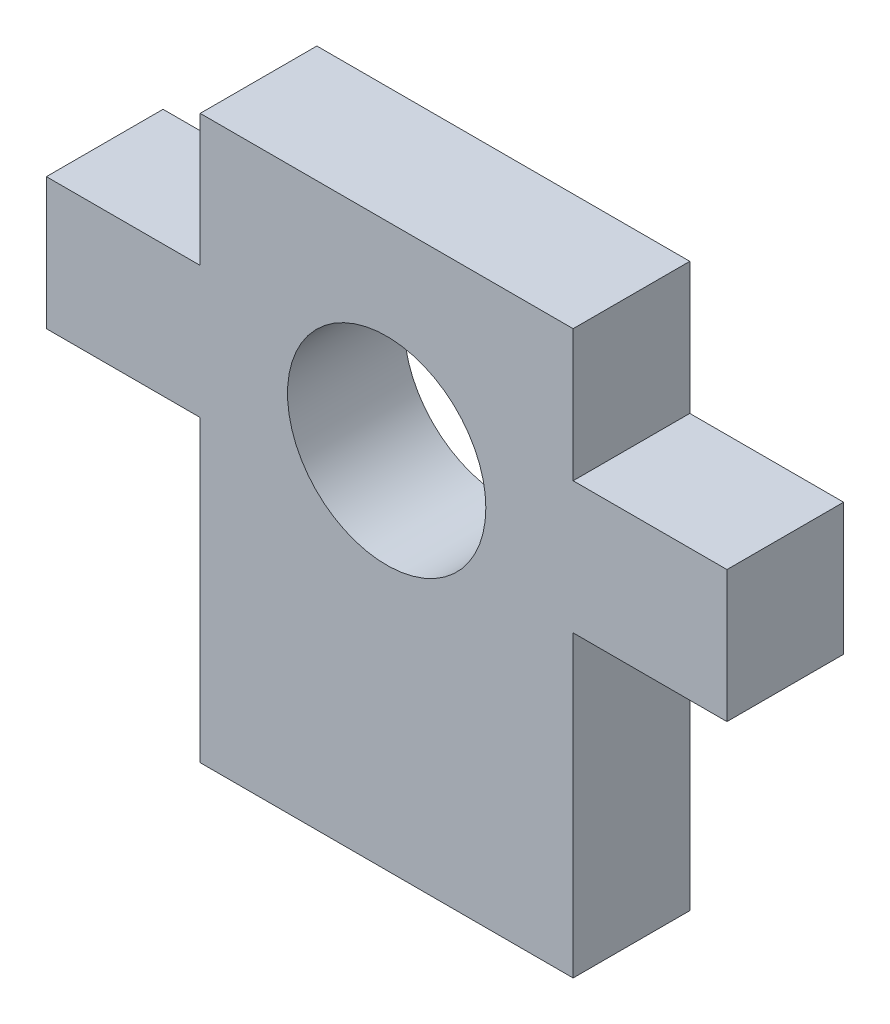
ISO-10303-21;
HEADER;
FILE_DESCRIPTION(('STEP AP214'),'2;1');
FILE_NAME('part.step','',(''),(''),'','','');
FILE_SCHEMA(('AUTOMOTIVE_DESIGN { 1 0 10303 214 1 1 1 1 }'));
ENDSEC;
DATA;
#1=APPLICATION_CONTEXT('core data for automotive mechanical design processes');
#2=APPLICATION_PROTOCOL_DEFINITION('international standard','automotive_design',2000,#1);
#3=PRODUCT_CONTEXT('',#1,'mechanical');
#4=PRODUCT('Part','Part','',(#3));
#5=PRODUCT_RELATED_PRODUCT_CATEGORY('part','',(#4));
#6=PRODUCT_DEFINITION_FORMATION('','',#4);
#7=PRODUCT_DEFINITION_CONTEXT('part definition',#1,'design');
#8=PRODUCT_DEFINITION('design','',#6,#7);
#9=PRODUCT_DEFINITION_SHAPE('','',#8);
#10=(LENGTH_UNIT() NAMED_UNIT(*) SI_UNIT(.MILLI.,.METRE.));
#11=(NAMED_UNIT(*) PLANE_ANGLE_UNIT() SI_UNIT($,.RADIAN.));
#12=(NAMED_UNIT(*) SI_UNIT($,.STERADIAN.) SOLID_ANGLE_UNIT());
#13=UNCERTAINTY_MEASURE_WITH_UNIT(LENGTH_MEASURE(1.E-05),#10,'distance_accuracy_value','');
#14=(GEOMETRIC_REPRESENTATION_CONTEXT(3) GLOBAL_UNCERTAINTY_ASSIGNED_CONTEXT((#13)) GLOBAL_UNIT_ASSIGNED_CONTEXT((#10,
#11,#12)) REPRESENTATION_CONTEXT('',''));
#15=CARTESIAN_POINT('',(0.,0.,0.));
#16=DIRECTION('',(0.,0.,1.));
#17=DIRECTION('',(1.,0.,0.));
#18=AXIS2_PLACEMENT_3D('',#15,#16,#17);
#19=CARTESIAN_POINT('',(-26.25,0.,9.));
#20=DIRECTION('',(1.,0.,0.));
#21=DIRECTION('',(0.,0.,-1.));
#22=AXIS2_PLACEMENT_3D('',#19,#20,#21);
#23=PLANE('',#22);
#24=DIRECTION('',(0.,-1.,0.));
#25=VECTOR('',#24,1.);
#26=CARTESIAN_POINT('',(-26.25,0.,0.));
#27=LINE('',#26,#25);
#28=CARTESIAN_POINT('',(-26.25,11.53,0.));
#29=VERTEX_POINT('',#28);
#30=CARTESIAN_POINT('',(-26.25,1.36999999999999,0.));
#31=VERTEX_POINT('',#30);
#32=EDGE_CURVE('E157',#29,#31,#27,.T.);
#33=ORIENTED_EDGE('',*,*,#32,.T.);
#34=DIRECTION('',(0.,0.,-1.));
#35=VECTOR('',#34,1.);
#36=CARTESIAN_POINT('',(-26.25,1.36999999999999,9.));
#37=LINE('',#36,#35);
#38=CARTESIAN_POINT('',(-26.25,1.36999999999999,9.));
#39=VERTEX_POINT('',#38);
#40=EDGE_CURVE('E11',#39,#31,#37,.T.);
#41=ORIENTED_EDGE('',*,*,#40,.F.);
#42=DIRECTION('',(0.,-1.,0.));
#43=VECTOR('',#42,1.);
#44=CARTESIAN_POINT('',(-26.25,0.,9.));
#45=LINE('',#44,#43);
#46=CARTESIAN_POINT('',(-26.25,11.53,9.));
#47=VERTEX_POINT('',#46);
#48=EDGE_CURVE('E188',#47,#39,#45,.T.);
#49=ORIENTED_EDGE('',*,*,#48,.F.);
#50=DIRECTION('',(0.,0.,-1.));
#51=VECTOR('',#50,1.);
#52=CARTESIAN_POINT('',(-26.25,11.53,9.));
#53=LINE('',#52,#51);
#54=EDGE_CURVE('E52',#47,#29,#53,.T.);
#55=ORIENTED_EDGE('',*,*,#54,.T.);
#56=EDGE_LOOP('',(#33,#41,#49,#55));
#57=FACE_BOUND('',#56,.T.);
#58=ADVANCED_FACE('F36',(#57),#23,.F.);
#59=CARTESIAN_POINT('',(0.,1.36999999999999,9.));
#60=DIRECTION('',(0.,1.,0.));
#61=DIRECTION('',(0.,0.,1.));
#62=AXIS2_PLACEMENT_3D('',#59,#60,#61);
#63=PLANE('',#62);
#64=DIRECTION('',(1.,0.,0.));
#65=VECTOR('',#64,1.);
#66=CARTESIAN_POINT('',(0.,1.36999999999999,0.));
#67=LINE('',#66,#65);
#68=CARTESIAN_POINT('',(-14.385,1.36999999999999,0.));
#69=VERTEX_POINT('',#68);
#70=EDGE_CURVE('E159',#31,#69,#67,.T.);
#71=ORIENTED_EDGE('',*,*,#70,.T.);
#72=DIRECTION('',(0.,0.,-1.));
#73=VECTOR('',#72,1.);
#74=CARTESIAN_POINT('',(-14.385,1.36999999999999,9.));
#75=LINE('',#74,#73);
#76=CARTESIAN_POINT('',(-14.385,1.36999999999999,9.));
#77=VERTEX_POINT('',#76);
#78=EDGE_CURVE('E44',#77,#69,#75,.T.);
#79=ORIENTED_EDGE('',*,*,#78,.F.);
#80=DIRECTION('',(1.,0.,0.));
#81=VECTOR('',#80,1.);
#82=CARTESIAN_POINT('',(0.,1.36999999999999,9.));
#83=LINE('',#82,#81);
#84=EDGE_CURVE('E102',#39,#77,#83,.T.);
#85=ORIENTED_EDGE('',*,*,#84,.F.);
#86=ORIENTED_EDGE('',*,*,#40,.T.);
#87=EDGE_LOOP('',(#71,#79,#85,#86));
#88=FACE_BOUND('',#87,.T.);
#89=ADVANCED_FACE('F211',(#88),#63,.F.);
#90=CARTESIAN_POINT('',(-14.385,0.,9.));
#91=DIRECTION('',(-1.,0.,0.));
#92=DIRECTION('',(0.,0.,1.));
#93=AXIS2_PLACEMENT_3D('',#90,#91,#92);
#94=PLANE('',#93);
#95=DIRECTION('',(0.,1.,0.));
#96=VECTOR('',#95,1.);
#97=CARTESIAN_POINT('',(-14.385,0.,0.));
#98=LINE('',#97,#96);
#99=CARTESIAN_POINT('',(-14.385,-21.69,0.));
#100=VERTEX_POINT('',#99);
#101=EDGE_CURVE('E163',#100,#69,#98,.T.);
#102=ORIENTED_EDGE('',*,*,#101,.F.);
#103=DIRECTION('',(0.,0.,-1.));
#104=VECTOR('',#103,1.);
#105=CARTESIAN_POINT('',(-14.385,-21.69,9.));
#106=LINE('',#105,#104);
#107=CARTESIAN_POINT('',(-14.385,-21.69,9.));
#108=VERTEX_POINT('',#107);
#109=EDGE_CURVE('E204',#108,#100,#106,.T.);
#110=ORIENTED_EDGE('',*,*,#109,.F.);
#111=DIRECTION('',(0.,1.,0.));
#112=VECTOR('',#111,1.);
#113=CARTESIAN_POINT('',(-14.385,0.,9.));
#114=LINE('',#113,#112);
#115=EDGE_CURVE('E210',#108,#77,#114,.T.);
#116=ORIENTED_EDGE('',*,*,#115,.T.);
#117=ORIENTED_EDGE('',*,*,#78,.T.);
#118=EDGE_LOOP('',(#102,#110,#116,#117));
#119=FACE_BOUND('',#118,.T.);
#120=ADVANCED_FACE('F208',(#119),#94,.T.);
#121=CARTESIAN_POINT('',(0.,-21.69,9.));
#122=DIRECTION('',(0.,1.,0.));
#123=DIRECTION('',(0.,0.,1.));
#124=AXIS2_PLACEMENT_3D('',#121,#122,#123);
#125=PLANE('',#124);
#126=DIRECTION('',(1.,0.,0.));
#127=VECTOR('',#126,1.);
#128=CARTESIAN_POINT('',(0.,-21.69,0.));
#129=LINE('',#128,#127);
#130=CARTESIAN_POINT('',(14.385,-21.69,0.));
#131=VERTEX_POINT('',#130);
#132=EDGE_CURVE('E166',#100,#131,#129,.T.);
#133=ORIENTED_EDGE('',*,*,#132,.T.);
#134=DIRECTION('',(0.,0.,-1.));
#135=VECTOR('',#134,1.);
#136=CARTESIAN_POINT('',(14.385,-21.69,9.));
#137=LINE('',#136,#135);
#138=CARTESIAN_POINT('',(14.385,-21.69,9.));
#139=VERTEX_POINT('',#138);
#140=EDGE_CURVE('E201',#139,#131,#137,.T.);
#141=ORIENTED_EDGE('',*,*,#140,.F.);
#142=DIRECTION('',(1.,0.,0.));
#143=VECTOR('',#142,1.);
#144=CARTESIAN_POINT('',(0.,-21.69,9.));
#145=LINE('',#144,#143);
#146=EDGE_CURVE('E229',#108,#139,#145,.T.);
#147=ORIENTED_EDGE('',*,*,#146,.F.);
#148=ORIENTED_EDGE('',*,*,#109,.T.);
#149=EDGE_LOOP('',(#133,#141,#147,#148));
#150=FACE_BOUND('',#149,.T.);
#151=ADVANCED_FACE('F220',(#150),#125,.F.);
#152=CARTESIAN_POINT('',(14.385,0.,9.));
#153=DIRECTION('',(-1.,0.,0.));
#154=DIRECTION('',(0.,0.,1.));
#155=AXIS2_PLACEMENT_3D('',#152,#153,#154);
#156=PLANE('',#155);
#157=DIRECTION('',(0.,1.,0.));
#158=VECTOR('',#157,1.);
#159=CARTESIAN_POINT('',(14.385,0.,0.));
#160=LINE('',#159,#158);
#161=CARTESIAN_POINT('',(14.385,1.36999999999999,0.));
#162=VERTEX_POINT('',#161);
#163=EDGE_CURVE('E168',#131,#162,#160,.T.);
#164=ORIENTED_EDGE('',*,*,#163,.T.);
#165=DIRECTION('',(0.,0.,-1.));
#166=VECTOR('',#165,1.);
#167=CARTESIAN_POINT('',(14.385,1.36999999999999,9.));
#168=LINE('',#167,#166);
#169=CARTESIAN_POINT('',(14.385,1.36999999999999,9.));
#170=VERTEX_POINT('',#169);
#171=EDGE_CURVE('E198',#170,#162,#168,.T.);
#172=ORIENTED_EDGE('',*,*,#171,.F.);
#173=DIRECTION('',(0.,1.,0.));
#174=VECTOR('',#173,1.);
#175=CARTESIAN_POINT('',(14.385,0.,9.));
#176=LINE('',#175,#174);
#177=EDGE_CURVE('E226',#139,#170,#176,.T.);
#178=ORIENTED_EDGE('',*,*,#177,.F.);
#179=ORIENTED_EDGE('',*,*,#140,.T.);
#180=EDGE_LOOP('',(#164,#172,#178,#179));
#181=FACE_BOUND('',#180,.T.);
#182=ADVANCED_FACE('F224',(#181),#156,.F.);
#183=CARTESIAN_POINT('',(0.,1.36999999999999,9.));
#184=DIRECTION('',(0.,1.,0.));
#185=DIRECTION('',(0.,0.,1.));
#186=AXIS2_PLACEMENT_3D('',#183,#184,#185);
#187=PLANE('',#186);
#188=DIRECTION('',(1.,0.,0.));
#189=VECTOR('',#188,1.);
#190=CARTESIAN_POINT('',(0.,1.36999999999999,0.));
#191=LINE('',#190,#189);
#192=CARTESIAN_POINT('',(26.25,1.36999999999999,0.));
#193=VERTEX_POINT('',#192);
#194=EDGE_CURVE('E170',#162,#193,#191,.T.);
#195=ORIENTED_EDGE('',*,*,#194,.T.);
#196=DIRECTION('',(0.,0.,-1.));
#197=VECTOR('',#196,1.);
#198=CARTESIAN_POINT('',(26.25,1.36999999999999,9.));
#199=LINE('',#198,#197);
#200=CARTESIAN_POINT('',(26.25,1.36999999999999,9.));
#201=VERTEX_POINT('',#200);
#202=EDGE_CURVE('E196',#201,#193,#199,.T.);
#203=ORIENTED_EDGE('',*,*,#202,.F.);
#204=DIRECTION('',(1.,0.,0.));
#205=VECTOR('',#204,1.);
#206=CARTESIAN_POINT('',(0.,1.36999999999999,9.));
#207=LINE('',#206,#205);
#208=EDGE_CURVE('E228',#170,#201,#207,.T.);
#209=ORIENTED_EDGE('',*,*,#208,.F.);
#210=ORIENTED_EDGE('',*,*,#171,.T.);
#211=EDGE_LOOP('',(#195,#203,#209,#210));
#212=FACE_BOUND('',#211,.T.);
#213=ADVANCED_FACE('F338',(#212),#187,.F.);
#214=CARTESIAN_POINT('',(26.25,0.,9.));
#215=DIRECTION('',(1.,0.,0.));
#216=DIRECTION('',(0.,0.,-1.));
#217=AXIS2_PLACEMENT_3D('',#214,#215,#216);
#218=PLANE('',#217);
#219=DIRECTION('',(0.,-1.,0.));
#220=VECTOR('',#219,1.);
#221=CARTESIAN_POINT('',(26.25,0.,0.));
#222=LINE('',#221,#220);
#223=CARTESIAN_POINT('',(26.25,11.53,0.));
#224=VERTEX_POINT('',#223);
#225=EDGE_CURVE('E173',#224,#193,#222,.T.);
#226=ORIENTED_EDGE('',*,*,#225,.F.);
#227=DIRECTION('',(0.,0.,-1.));
#228=VECTOR('',#227,1.);
#229=CARTESIAN_POINT('',(26.25,11.53,9.));
#230=LINE('',#229,#228);
#231=CARTESIAN_POINT('',(26.25,11.53,9.));
#232=VERTEX_POINT('',#231);
#233=EDGE_CURVE('E194',#232,#224,#230,.T.);
#234=ORIENTED_EDGE('',*,*,#233,.F.);
#235=DIRECTION('',(0.,-1.,0.));
#236=VECTOR('',#235,1.);
#237=CARTESIAN_POINT('',(26.25,0.,9.));
#238=LINE('',#237,#236);
#239=EDGE_CURVE('E231',#232,#201,#238,.T.);
#240=ORIENTED_EDGE('',*,*,#239,.T.);
#241=ORIENTED_EDGE('',*,*,#202,.T.);
#242=EDGE_LOOP('',(#226,#234,#240,#241));
#243=FACE_BOUND('',#242,.T.);
#244=ADVANCED_FACE('F247',(#243),#218,.T.);
#245=CARTESIAN_POINT('',(0.,11.53,9.));
#246=DIRECTION('',(0.,1.,0.));
#247=DIRECTION('',(0.,0.,1.));
#248=AXIS2_PLACEMENT_3D('',#245,#246,#247);
#249=PLANE('',#248);
#250=DIRECTION('',(1.,0.,0.));
#251=VECTOR('',#250,1.);
#252=CARTESIAN_POINT('',(0.,11.53,0.));
#253=LINE('',#252,#251);
#254=CARTESIAN_POINT('',(14.385,11.53,0.));
#255=VERTEX_POINT('',#254);
#256=EDGE_CURVE('E176',#255,#224,#253,.T.);
#257=ORIENTED_EDGE('',*,*,#256,.F.);
#258=DIRECTION('',(0.,0.,-1.));
#259=VECTOR('',#258,1.);
#260=CARTESIAN_POINT('',(14.385,11.53,9.));
#261=LINE('',#260,#259);
#262=CARTESIAN_POINT('',(14.385,11.53,9.));
#263=VERTEX_POINT('',#262);
#264=EDGE_CURVE('E192',#263,#255,#261,.T.);
#265=ORIENTED_EDGE('',*,*,#264,.F.);
#266=DIRECTION('',(1.,0.,0.));
#267=VECTOR('',#266,1.);
#268=CARTESIAN_POINT('',(0.,11.53,9.));
#269=LINE('',#268,#267);
#270=EDGE_CURVE('E238',#263,#232,#269,.T.);
#271=ORIENTED_EDGE('',*,*,#270,.T.);
#272=ORIENTED_EDGE('',*,*,#233,.T.);
#273=EDGE_LOOP('',(#257,#265,#271,#272));
#274=FACE_BOUND('',#273,.T.);
#275=ADVANCED_FACE('F242',(#274),#249,.T.);
#276=CARTESIAN_POINT('',(14.385,0.,9.));
#277=DIRECTION('',(-1.,0.,0.));
#278=DIRECTION('',(0.,0.,1.));
#279=AXIS2_PLACEMENT_3D('',#276,#277,#278);
#280=PLANE('',#279);
#281=DIRECTION('',(0.,1.,0.));
#282=VECTOR('',#281,1.);
#283=CARTESIAN_POINT('',(14.385,0.,0.));
#284=LINE('',#283,#282);
#285=CARTESIAN_POINT('',(14.385,21.69,0.));
#286=VERTEX_POINT('',#285);
#287=EDGE_CURVE('E179',#255,#286,#284,.T.);
#288=ORIENTED_EDGE('',*,*,#287,.T.);
#289=DIRECTION('',(0.,0.,-1.));
#290=VECTOR('',#289,1.);
#291=CARTESIAN_POINT('',(14.385,21.69,9.));
#292=LINE('',#291,#290);
#293=CARTESIAN_POINT('',(14.385,21.69,9.));
#294=VERTEX_POINT('',#293);
#295=EDGE_CURVE('E139',#294,#286,#292,.T.);
#296=ORIENTED_EDGE('',*,*,#295,.F.);
#297=DIRECTION('',(0.,1.,0.));
#298=VECTOR('',#297,1.);
#299=CARTESIAN_POINT('',(14.385,0.,9.));
#300=LINE('',#299,#298);
#301=EDGE_CURVE('E148',#263,#294,#300,.T.);
#302=ORIENTED_EDGE('',*,*,#301,.F.);
#303=ORIENTED_EDGE('',*,*,#264,.T.);
#304=EDGE_LOOP('',(#288,#296,#302,#303));
#305=FACE_BOUND('',#304,.T.);
#306=ADVANCED_FACE('F250',(#305),#280,.F.);
#307=CARTESIAN_POINT('',(0.,21.69,9.));
#308=DIRECTION('',(0.,1.,0.));
#309=DIRECTION('',(0.,0.,1.));
#310=AXIS2_PLACEMENT_3D('',#307,#308,#309);
#311=PLANE('',#310);
#312=DIRECTION('',(1.,0.,0.));
#313=VECTOR('',#312,1.);
#314=CARTESIAN_POINT('',(0.,21.69,0.));
#315=LINE('',#314,#313);
#316=CARTESIAN_POINT('',(-14.385,21.69,0.));
#317=VERTEX_POINT('',#316);
#318=EDGE_CURVE('E135',#317,#286,#315,.T.);
#319=ORIENTED_EDGE('',*,*,#318,.F.);
#320=DIRECTION('',(0.,0.,-1.));
#321=VECTOR('',#320,1.);
#322=CARTESIAN_POINT('',(-14.385,21.69,9.));
#323=LINE('',#322,#321);
#324=CARTESIAN_POINT('',(-14.385,21.69,9.));
#325=VERTEX_POINT('',#324);
#326=EDGE_CURVE('E130',#325,#317,#323,.T.);
#327=ORIENTED_EDGE('',*,*,#326,.F.);
#328=DIRECTION('',(1.,0.,0.));
#329=VECTOR('',#328,1.);
#330=CARTESIAN_POINT('',(0.,21.69,9.));
#331=LINE('',#330,#329);
#332=EDGE_CURVE('E133',#325,#294,#331,.T.);
#333=ORIENTED_EDGE('',*,*,#332,.T.);
#334=ORIENTED_EDGE('',*,*,#295,.T.);
#335=EDGE_LOOP('',(#319,#327,#333,#334));
#336=FACE_BOUND('',#335,.T.);
#337=ADVANCED_FACE('F132',(#336),#311,.T.);
#338=CARTESIAN_POINT('',(-14.385,0.,9.));
#339=DIRECTION('',(-1.,0.,0.));
#340=DIRECTION('',(0.,0.,1.));
#341=AXIS2_PLACEMENT_3D('',#338,#339,#340);
#342=PLANE('',#341);
#343=DIRECTION('',(0.,1.,0.));
#344=VECTOR('',#343,1.);
#345=CARTESIAN_POINT('',(-14.385,0.,0.));
#346=LINE('',#345,#344);
#347=CARTESIAN_POINT('',(-14.385,11.53,0.));
#348=VERTEX_POINT('',#347);
#349=EDGE_CURVE('E183',#348,#317,#346,.T.);
#350=ORIENTED_EDGE('',*,*,#349,.F.);
#351=DIRECTION('',(0.,0.,-1.));
#352=VECTOR('',#351,1.);
#353=CARTESIAN_POINT('',(-14.385,11.53,9.));
#354=LINE('',#353,#352);
#355=CARTESIAN_POINT('',(-14.385,11.53,9.));
#356=VERTEX_POINT('',#355);
#357=EDGE_CURVE('E90',#356,#348,#354,.T.);
#358=ORIENTED_EDGE('',*,*,#357,.F.);
#359=DIRECTION('',(0.,1.,0.));
#360=VECTOR('',#359,1.);
#361=CARTESIAN_POINT('',(-14.385,0.,9.));
#362=LINE('',#361,#360);
#363=EDGE_CURVE('E145',#356,#325,#362,.T.);
#364=ORIENTED_EDGE('',*,*,#363,.T.);
#365=ORIENTED_EDGE('',*,*,#326,.T.);
#366=EDGE_LOOP('',(#350,#358,#364,#365));
#367=FACE_BOUND('',#366,.T.);
#368=ADVANCED_FACE('F151',(#367),#342,.T.);
#369=CARTESIAN_POINT('',(0.,11.53,9.));
#370=DIRECTION('',(0.,1.,0.));
#371=DIRECTION('',(0.,0.,1.));
#372=AXIS2_PLACEMENT_3D('',#369,#370,#371);
#373=PLANE('',#372);
#374=DIRECTION('',(1.,0.,0.));
#375=VECTOR('',#374,1.);
#376=CARTESIAN_POINT('',(0.,11.53,0.));
#377=LINE('',#376,#375);
#378=EDGE_CURVE('E185',#29,#348,#377,.T.);
#379=ORIENTED_EDGE('',*,*,#378,.F.);
#380=ORIENTED_EDGE('',*,*,#54,.F.);
#381=DIRECTION('',(1.,0.,0.));
#382=VECTOR('',#381,1.);
#383=CARTESIAN_POINT('',(0.,11.53,9.));
#384=LINE('',#383,#382);
#385=EDGE_CURVE('E152',#47,#356,#384,.T.);
#386=ORIENTED_EDGE('',*,*,#385,.T.);
#387=ORIENTED_EDGE('',*,*,#357,.T.);
#388=EDGE_LOOP('',(#379,#380,#386,#387));
#389=FACE_BOUND('',#388,.T.);
#390=ADVANCED_FACE('F263',(#389),#373,.T.);
#391=CARTESIAN_POINT('',(0.,0.,9.));
#392=DIRECTION('',(0.,0.,1.));
#393=DIRECTION('',(1.,0.,0.));
#394=AXIS2_PLACEMENT_3D('',#391,#392,#393);
#395=PLANE('',#394);
#396=CARTESIAN_POINT('',(0.,6.35,9.));
#397=DIRECTION('',(0.,0.,1.));
#398=DIRECTION('',(1.,0.,0.));
#399=AXIS2_PLACEMENT_3D('',#396,#397,#398);
#400=CIRCLE('',#399,7.65);
#401=CARTESIAN_POINT('',(7.65,6.35,9.));
#402=VERTEX_POINT('',#401);
#403=EDGE_CURVE('E287',#402,#402,#400,.T.);
#404=ORIENTED_EDGE('',*,*,#403,.F.);
#405=EDGE_LOOP('',(#404));
#406=FACE_BOUND('',#405,.T.);
#407=ORIENTED_EDGE('',*,*,#48,.T.);
#408=ORIENTED_EDGE('',*,*,#84,.T.);
#409=ORIENTED_EDGE('',*,*,#115,.F.);
#410=ORIENTED_EDGE('',*,*,#146,.T.);
#411=ORIENTED_EDGE('',*,*,#177,.T.);
#412=ORIENTED_EDGE('',*,*,#208,.T.);
#413=ORIENTED_EDGE('',*,*,#239,.F.);
#414=ORIENTED_EDGE('',*,*,#270,.F.);
#415=ORIENTED_EDGE('',*,*,#301,.T.);
#416=ORIENTED_EDGE('',*,*,#332,.F.);
#417=ORIENTED_EDGE('',*,*,#363,.F.);
#418=ORIENTED_EDGE('',*,*,#385,.F.);
#419=EDGE_LOOP('',(#407,#408,#409,#410,#411,#412,#413,#414,#415,#416,#417,#418));
#420=FACE_BOUND('',#419,.T.);
#421=ADVANCED_FACE('F143',(#406,#420),#395,.T.);
#422=CARTESIAN_POINT('',(0.,0.,0.));
#423=DIRECTION('',(0.,0.,1.));
#424=DIRECTION('',(1.,0.,0.));
#425=AXIS2_PLACEMENT_3D('',#422,#423,#424);
#426=PLANE('',#425);
#427=CARTESIAN_POINT('',(0.,6.35,0.));
#428=DIRECTION('',(0.,0.,1.));
#429=DIRECTION('',(1.,0.,0.));
#430=AXIS2_PLACEMENT_3D('',#427,#428,#429);
#431=CIRCLE('',#430,7.65);
#432=CARTESIAN_POINT('',(7.65,6.35,0.));
#433=VERTEX_POINT('',#432);
#434=EDGE_CURVE('E160',#433,#433,#431,.T.);
#435=ORIENTED_EDGE('',*,*,#434,.T.);
#436=EDGE_LOOP('',(#435));
#437=FACE_BOUND('',#436,.T.);
#438=ORIENTED_EDGE('',*,*,#32,.F.);
#439=ORIENTED_EDGE('',*,*,#378,.T.);
#440=ORIENTED_EDGE('',*,*,#349,.T.);
#441=ORIENTED_EDGE('',*,*,#318,.T.);
#442=ORIENTED_EDGE('',*,*,#287,.F.);
#443=ORIENTED_EDGE('',*,*,#256,.T.);
#444=ORIENTED_EDGE('',*,*,#225,.T.);
#445=ORIENTED_EDGE('',*,*,#194,.F.);
#446=ORIENTED_EDGE('',*,*,#163,.F.);
#447=ORIENTED_EDGE('',*,*,#132,.F.);
#448=ORIENTED_EDGE('',*,*,#101,.T.);
#449=ORIENTED_EDGE('',*,*,#70,.F.);
#450=EDGE_LOOP('',(#438,#439,#440,#441,#442,#443,#444,#445,#446,#447,#448,#449));
#451=FACE_BOUND('',#450,.T.);
#452=ADVANCED_FACE('F215',(#437,#451),#426,.F.);
#453=CARTESIAN_POINT('',(0.,6.35,0.));
#454=DIRECTION('',(0.,0.,1.));
#455=DIRECTION('',(1.,0.,0.));
#456=AXIS2_PLACEMENT_3D('',#453,#454,#455);
#457=CYLINDRICAL_SURFACE('',#456,7.65);
#458=ORIENTED_EDGE('',*,*,#434,.F.);
#459=EDGE_LOOP('',(#458));
#460=FACE_BOUND('',#459,.T.);
#461=ORIENTED_EDGE('',*,*,#403,.T.);
#462=EDGE_LOOP('',(#461));
#463=FACE_BOUND('',#462,.T.);
#464=ADVANCED_FACE('F275',(#460,#463),#457,.F.);
#465=CLOSED_SHELL('',(#58,#89,#120,#151,#182,#213,#244,#275,#306,#337,#368,#390,#421,#452,#464));
#466=MANIFOLD_SOLID_BREP('B2',#465);
#467=ADVANCED_BREP_SHAPE_REPRESENTATION('',(#18,#466),#14);
#468=SHAPE_DEFINITION_REPRESENTATION(#9,#467);
ENDSEC;
END-ISO-10303-21;
